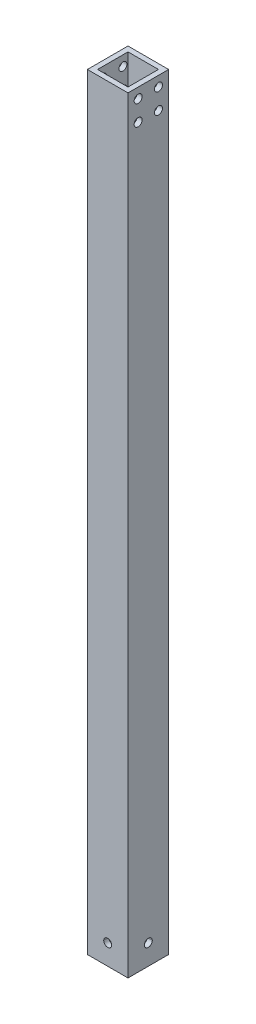
ISO-10303-21;
HEADER;
FILE_DESCRIPTION(('STEP AP214'),'2;1');
FILE_NAME('part.step','',(''),(''),'','','');
FILE_SCHEMA(('AUTOMOTIVE_DESIGN { 1 0 10303 214 1 1 1 1 }'));
ENDSEC;
DATA;
#1=APPLICATION_CONTEXT('core data for automotive mechanical design processes');
#2=APPLICATION_PROTOCOL_DEFINITION('international standard','automotive_design',2000,#1);
#3=PRODUCT_CONTEXT('',#1,'mechanical');
#4=PRODUCT('Part','Part','',(#3));
#5=PRODUCT_RELATED_PRODUCT_CATEGORY('part','',(#4));
#6=PRODUCT_DEFINITION_FORMATION('','',#4);
#7=PRODUCT_DEFINITION_CONTEXT('part definition',#1,'design');
#8=PRODUCT_DEFINITION('design','',#6,#7);
#9=PRODUCT_DEFINITION_SHAPE('','',#8);
#10=(LENGTH_UNIT() NAMED_UNIT(*) SI_UNIT(.MILLI.,.METRE.));
#11=(NAMED_UNIT(*) PLANE_ANGLE_UNIT() SI_UNIT($,.RADIAN.));
#12=(NAMED_UNIT(*) SI_UNIT($,.STERADIAN.) SOLID_ANGLE_UNIT());
#13=UNCERTAINTY_MEASURE_WITH_UNIT(LENGTH_MEASURE(1.E-05),#10,'distance_accuracy_value','');
#14=(GEOMETRIC_REPRESENTATION_CONTEXT(3) GLOBAL_UNCERTAINTY_ASSIGNED_CONTEXT((#13)) GLOBAL_UNIT_ASSIGNED_CONTEXT((#10,
#11,#12)) REPRESENTATION_CONTEXT('',''));
#15=CARTESIAN_POINT('',(0.,0.,0.));
#16=DIRECTION('',(0.,0.,1.));
#17=DIRECTION('',(1.,0.,0.));
#18=AXIS2_PLACEMENT_3D('',#15,#16,#17);
#19=CARTESIAN_POINT('',(-12.7,-227.0125,0.));
#20=DIRECTION('',(1.,0.,0.));
#21=DIRECTION('',(0.,0.,-1.));
#22=AXIS2_PLACEMENT_3D('',#19,#20,#21);
#23=CYLINDRICAL_SURFACE('',#22,2.4892);
#24=DIRECTION('',(1.,0.,0.));
#25=VECTOR('',#24,1.);
#26=CARTESIAN_POINT('',(-12.7,-227.0125,2.4892));
#27=LINE('',#26,#25);
#28=CARTESIAN_POINT('',(9.525,-227.0125,2.4892));
#29=VERTEX_POINT('',#28);
#30=CARTESIAN_POINT('',(12.7,-227.0125,2.4892));
#31=VERTEX_POINT('',#30);
#32=EDGE_CURVE('E214',#29,#31,#27,.T.);
#33=ORIENTED_EDGE('',*,*,#32,.F.);
#34=CARTESIAN_POINT('',(9.525,-227.0125,0.));
#35=DIRECTION('',(-1.,0.,0.));
#36=DIRECTION('',(0.,0.,1.));
#37=AXIS2_PLACEMENT_3D('',#34,#35,#36);
#38=CIRCLE('',#37,2.4892);
#39=CARTESIAN_POINT('',(9.525,-227.0125,-2.4892));
#40=VERTEX_POINT('',#39);
#41=EDGE_CURVE('E170',#29,#40,#38,.T.);
#42=ORIENTED_EDGE('',*,*,#41,.T.);
#43=DIRECTION('',(1.,0.,0.));
#44=VECTOR('',#43,1.);
#45=CARTESIAN_POINT('',(-12.7,-227.0125,-2.4892));
#46=LINE('',#45,#44);
#47=CARTESIAN_POINT('',(12.7,-227.0125,-2.4892));
#48=VERTEX_POINT('',#47);
#49=EDGE_CURVE('E226',#40,#48,#46,.T.);
#50=ORIENTED_EDGE('',*,*,#49,.T.);
#51=CARTESIAN_POINT('',(12.7,-227.0125,0.));
#52=DIRECTION('',(1.,0.,0.));
#53=DIRECTION('',(0.,0.,-1.));
#54=AXIS2_PLACEMENT_3D('',#51,#52,#53);
#55=CIRCLE('',#54,2.4892);
#56=EDGE_CURVE('E258',#48,#31,#55,.T.);
#57=ORIENTED_EDGE('',*,*,#56,.T.);
#58=EDGE_LOOP('',(#33,#42,#50,#57));
#59=FACE_BOUND('',#58,.T.);
#60=ADVANCED_FACE('F43',(#59),#23,.F.);
#61=CARTESIAN_POINT('',(-12.7,-227.0125,0.));
#62=DIRECTION('',(1.,0.,0.));
#63=DIRECTION('',(0.,0.,-1.));
#64=AXIS2_PLACEMENT_3D('',#61,#62,#63);
#65=CYLINDRICAL_SURFACE('',#64,2.4892);
#66=DIRECTION('',(1.,0.,0.));
#67=VECTOR('',#66,1.);
#68=CARTESIAN_POINT('',(-12.7,-227.0125,2.4892));
#69=LINE('',#68,#67);
#70=CARTESIAN_POINT('',(-12.7,-227.0125,2.4892));
#71=VERTEX_POINT('',#70);
#72=CARTESIAN_POINT('',(-9.525,-227.0125,2.4892));
#73=VERTEX_POINT('',#72);
#74=EDGE_CURVE('E225',#71,#73,#69,.T.);
#75=ORIENTED_EDGE('',*,*,#74,.F.);
#76=CARTESIAN_POINT('',(-12.7,-227.0125,0.));
#77=DIRECTION('',(1.,0.,0.));
#78=DIRECTION('',(0.,0.,-1.));
#79=AXIS2_PLACEMENT_3D('',#76,#77,#78);
#80=CIRCLE('',#79,2.4892);
#81=CARTESIAN_POINT('',(-12.7,-227.0125,-2.4892));
#82=VERTEX_POINT('',#81);
#83=EDGE_CURVE('E287',#82,#71,#80,.T.);
#84=ORIENTED_EDGE('',*,*,#83,.F.);
#85=DIRECTION('',(1.,0.,0.));
#86=VECTOR('',#85,1.);
#87=CARTESIAN_POINT('',(-12.7,-227.0125,-2.4892));
#88=LINE('',#87,#86);
#89=CARTESIAN_POINT('',(-9.525,-227.0125,-2.4892));
#90=VERTEX_POINT('',#89);
#91=EDGE_CURVE('E216',#82,#90,#88,.T.);
#92=ORIENTED_EDGE('',*,*,#91,.T.);
#93=CARTESIAN_POINT('',(-9.525,-227.0125,0.));
#94=DIRECTION('',(1.,0.,0.));
#95=DIRECTION('',(0.,0.,-1.));
#96=AXIS2_PLACEMENT_3D('',#93,#94,#95);
#97=CIRCLE('',#96,2.4892);
#98=EDGE_CURVE('E54',#90,#73,#97,.T.);
#99=ORIENTED_EDGE('',*,*,#98,.T.);
#100=EDGE_LOOP('',(#75,#84,#92,#99));
#101=FACE_BOUND('',#100,.T.);
#102=ADVANCED_FACE('F498',(#101),#65,.F.);
#103=CARTESIAN_POINT('',(0.,-227.0125,-12.7));
#104=DIRECTION('',(0.,0.,1.));
#105=DIRECTION('',(1.,0.,0.));
#106=AXIS2_PLACEMENT_3D('',#103,#104,#105);
#107=CYLINDRICAL_SURFACE('',#106,2.4892);
#108=DIRECTION('',(0.,0.,1.));
#109=VECTOR('',#108,1.);
#110=CARTESIAN_POINT('',(-2.4892,-227.0125,-12.7));
#111=LINE('',#110,#109);
#112=CARTESIAN_POINT('',(-2.4892,-227.0125,-12.7));
#113=VERTEX_POINT('',#112);
#114=CARTESIAN_POINT('',(-2.4892,-227.0125,-9.525));
#115=VERTEX_POINT('',#114);
#116=EDGE_CURVE('E253',#113,#115,#111,.T.);
#117=ORIENTED_EDGE('',*,*,#116,.F.);
#118=CARTESIAN_POINT('',(0.,-227.0125,-12.7));
#119=DIRECTION('',(0.,0.,1.));
#120=DIRECTION('',(1.,0.,0.));
#121=AXIS2_PLACEMENT_3D('',#118,#119,#120);
#122=CIRCLE('',#121,2.4892);
#123=CARTESIAN_POINT('',(2.4892,-227.0125,-12.7));
#124=VERTEX_POINT('',#123);
#125=EDGE_CURVE('E272',#124,#113,#122,.T.);
#126=ORIENTED_EDGE('',*,*,#125,.F.);
#127=DIRECTION('',(0.,0.,1.));
#128=VECTOR('',#127,1.);
#129=CARTESIAN_POINT('',(2.4892,-227.0125,-12.7));
#130=LINE('',#129,#128);
#131=CARTESIAN_POINT('',(2.4892,-227.0125,-9.525));
#132=VERTEX_POINT('',#131);
#133=EDGE_CURVE('E231',#124,#132,#130,.T.);
#134=ORIENTED_EDGE('',*,*,#133,.T.);
#135=CARTESIAN_POINT('',(0.,-227.0125,-9.525));
#136=DIRECTION('',(0.,0.,1.));
#137=DIRECTION('',(1.,0.,0.));
#138=AXIS2_PLACEMENT_3D('',#135,#136,#137);
#139=CIRCLE('',#138,2.4892);
#140=EDGE_CURVE('E247',#132,#115,#139,.T.);
#141=ORIENTED_EDGE('',*,*,#140,.T.);
#142=EDGE_LOOP('',(#117,#126,#134,#141));
#143=FACE_BOUND('',#142,.T.);
#144=ADVANCED_FACE('F434',(#143),#107,.F.);
#145=CARTESIAN_POINT('',(0.,-227.0125,-12.7));
#146=DIRECTION('',(0.,0.,1.));
#147=DIRECTION('',(1.,0.,0.));
#148=AXIS2_PLACEMENT_3D('',#145,#146,#147);
#149=CYLINDRICAL_SURFACE('',#148,2.4892);
#150=DIRECTION('',(0.,0.,1.));
#151=VECTOR('',#150,1.);
#152=CARTESIAN_POINT('',(-2.4892,-227.0125,-12.7));
#153=LINE('',#152,#151);
#154=CARTESIAN_POINT('',(-2.4892,-227.0125,9.525));
#155=VERTEX_POINT('',#154);
#156=CARTESIAN_POINT('',(-2.4892,-227.0125,12.7));
#157=VERTEX_POINT('',#156);
#158=EDGE_CURVE('E316',#155,#157,#153,.T.);
#159=ORIENTED_EDGE('',*,*,#158,.F.);
#160=CARTESIAN_POINT('',(0.,-227.0125,9.525));
#161=DIRECTION('',(0.,0.,-1.));
#162=DIRECTION('',(-1.,0.,0.));
#163=AXIS2_PLACEMENT_3D('',#160,#161,#162);
#164=CIRCLE('',#163,2.4892);
#165=CARTESIAN_POINT('',(2.4892,-227.0125,9.525));
#166=VERTEX_POINT('',#165);
#167=EDGE_CURVE('E11',#155,#166,#164,.T.);
#168=ORIENTED_EDGE('',*,*,#167,.T.);
#169=DIRECTION('',(0.,0.,1.));
#170=VECTOR('',#169,1.);
#171=CARTESIAN_POINT('',(2.4892,-227.0125,-12.7));
#172=LINE('',#171,#170);
#173=CARTESIAN_POINT('',(2.4892,-227.0125,12.7));
#174=VERTEX_POINT('',#173);
#175=EDGE_CURVE('E246',#166,#174,#172,.T.);
#176=ORIENTED_EDGE('',*,*,#175,.T.);
#177=CARTESIAN_POINT('',(0.,-227.0125,12.7));
#178=DIRECTION('',(0.,0.,1.));
#179=DIRECTION('',(1.,0.,0.));
#180=AXIS2_PLACEMENT_3D('',#177,#178,#179);
#181=CIRCLE('',#180,2.4892);
#182=EDGE_CURVE('E278',#174,#157,#181,.T.);
#183=ORIENTED_EDGE('',*,*,#182,.T.);
#184=EDGE_LOOP('',(#159,#168,#176,#183));
#185=FACE_BOUND('',#184,.T.);
#186=ADVANCED_FACE('F407',(#185),#149,.F.);
#187=CARTESIAN_POINT('',(0.,239.7125,9.525));
#188=DIRECTION('',(0.,0.,-1.));
#189=DIRECTION('',(0.,-1.,0.));
#190=AXIS2_PLACEMENT_3D('',#187,#188,#189);
#191=PLANE('',#190);
#192=CARTESIAN_POINT('',(0.,-227.0125,9.525));
#193=DIRECTION('',(0.,0.,-1.));
#194=DIRECTION('',(-1.,0.,0.));
#195=AXIS2_PLACEMENT_3D('',#192,#193,#194);
#196=CIRCLE('',#195,2.4892);
#197=EDGE_CURVE('E234',#166,#155,#196,.T.);
#198=ORIENTED_EDGE('',*,*,#197,.F.);
#199=ORIENTED_EDGE('',*,*,#167,.F.);
#200=EDGE_LOOP('',(#198,#199));
#201=FACE_BOUND('',#200,.T.);
#202=DIRECTION('',(1.,0.,0.));
#203=VECTOR('',#202,1.);
#204=CARTESIAN_POINT('',(0.,-239.7125,9.525));
#205=LINE('',#204,#203);
#206=CARTESIAN_POINT('',(-9.525,-239.7125,9.525));
#207=VERTEX_POINT('',#206);
#208=CARTESIAN_POINT('',(9.525,-239.7125,9.525));
#209=VERTEX_POINT('',#208);
#210=EDGE_CURVE('E186',#207,#209,#205,.T.);
#211=ORIENTED_EDGE('',*,*,#210,.F.);
#212=DIRECTION('',(0.,-1.,0.));
#213=VECTOR('',#212,1.);
#214=CARTESIAN_POINT('',(-9.525,239.7125,9.525));
#215=LINE('',#214,#213);
#216=CARTESIAN_POINT('',(-9.525,239.7125,9.525));
#217=VERTEX_POINT('',#216);
#218=EDGE_CURVE('E68',#217,#207,#215,.T.);
#219=ORIENTED_EDGE('',*,*,#218,.F.);
#220=DIRECTION('',(1.,0.,0.));
#221=VECTOR('',#220,1.);
#222=CARTESIAN_POINT('',(0.,239.7125,9.525));
#223=LINE('',#222,#221);
#224=CARTESIAN_POINT('',(9.525,239.7125,9.525));
#225=VERTEX_POINT('',#224);
#226=EDGE_CURVE('E202',#217,#225,#223,.T.);
#227=ORIENTED_EDGE('',*,*,#226,.T.);
#228=DIRECTION('',(0.,-1.,0.));
#229=VECTOR('',#228,1.);
#230=CARTESIAN_POINT('',(9.525,239.7125,9.525));
#231=LINE('',#230,#229);
#232=EDGE_CURVE('E171',#225,#209,#231,.T.);
#233=ORIENTED_EDGE('',*,*,#232,.T.);
#234=EDGE_LOOP('',(#211,#219,#227,#233));
#235=FACE_BOUND('',#234,.T.);
#236=ADVANCED_FACE('F404',(#201,#235),#191,.T.);
#237=CARTESIAN_POINT('',(-9.525,239.7125,0.));
#238=DIRECTION('',(1.,0.,0.));
#239=DIRECTION('',(0.,1.,0.));
#240=AXIS2_PLACEMENT_3D('',#237,#238,#239);
#241=PLANE('',#240);
#242=CARTESIAN_POINT('',(-9.525,233.3625,6.35));
#243=DIRECTION('',(1.,0.,0.));
#244=DIRECTION('',(0.,0.,-1.));
#245=AXIS2_PLACEMENT_3D('',#242,#243,#244);
#246=CIRCLE('',#245,2.51460000000001);
#247=CARTESIAN_POINT('',(-9.525,233.3625,3.83539999999998));
#248=VERTEX_POINT('',#247);
#249=EDGE_CURVE('E215',#248,#248,#246,.T.);
#250=ORIENTED_EDGE('',*,*,#249,.F.);
#251=EDGE_LOOP('',(#250));
#252=FACE_BOUND('',#251,.T.);
#253=CARTESIAN_POINT('',(-9.525,220.6625,-6.35));
#254=DIRECTION('',(1.,0.,0.));
#255=DIRECTION('',(0.,0.,-1.));
#256=AXIS2_PLACEMENT_3D('',#253,#254,#255);
#257=CIRCLE('',#256,2.51460000000001);
#258=CARTESIAN_POINT('',(-9.525,220.6625,-8.86460000000001));
#259=VERTEX_POINT('',#258);
#260=EDGE_CURVE('E905',#259,#259,#257,.T.);
#261=ORIENTED_EDGE('',*,*,#260,.F.);
#262=EDGE_LOOP('',(#261));
#263=FACE_BOUND('',#262,.T.);
#264=CARTESIAN_POINT('',(-9.525,220.6625,6.35));
#265=DIRECTION('',(1.,0.,0.));
#266=DIRECTION('',(0.,0.,-1.));
#267=AXIS2_PLACEMENT_3D('',#264,#265,#266);
#268=CIRCLE('',#267,2.51460000000001);
#269=CARTESIAN_POINT('',(-9.525,220.6625,3.83539999999998));
#270=VERTEX_POINT('',#269);
#271=EDGE_CURVE('E899',#270,#270,#268,.T.);
#272=ORIENTED_EDGE('',*,*,#271,.F.);
#273=EDGE_LOOP('',(#272));
#274=FACE_BOUND('',#273,.T.);
#275=CARTESIAN_POINT('',(-9.525,233.3625,-6.35));
#276=DIRECTION('',(1.,0.,0.));
#277=DIRECTION('',(0.,0.,-1.));
#278=AXIS2_PLACEMENT_3D('',#275,#276,#277);
#279=CIRCLE('',#278,2.51460000000001);
#280=CARTESIAN_POINT('',(-9.525,233.3625,-8.86460000000001));
#281=VERTEX_POINT('',#280);
#282=EDGE_CURVE('E893',#281,#281,#279,.T.);
#283=ORIENTED_EDGE('',*,*,#282,.F.);
#284=EDGE_LOOP('',(#283));
#285=FACE_BOUND('',#284,.T.);
#286=ORIENTED_EDGE('',*,*,#98,.F.);
#287=CARTESIAN_POINT('',(-9.525,-227.0125,0.));
#288=DIRECTION('',(1.,0.,0.));
#289=DIRECTION('',(0.,0.,-1.));
#290=AXIS2_PLACEMENT_3D('',#287,#288,#289);
#291=CIRCLE('',#290,2.4892);
#292=EDGE_CURVE('E220',#73,#90,#291,.T.);
#293=ORIENTED_EDGE('',*,*,#292,.F.);
#294=EDGE_LOOP('',(#286,#293));
#295=FACE_BOUND('',#294,.T.);
#296=DIRECTION('',(0.,0.,1.));
#297=VECTOR('',#296,1.);
#298=CARTESIAN_POINT('',(-9.525,-239.7125,0.));
#299=LINE('',#298,#297);
#300=CARTESIAN_POINT('',(-9.525,-239.7125,-9.525));
#301=VERTEX_POINT('',#300);
#302=EDGE_CURVE('E181',#301,#207,#299,.T.);
#303=ORIENTED_EDGE('',*,*,#302,.F.);
#304=DIRECTION('',(0.,-1.,0.));
#305=VECTOR('',#304,1.);
#306=CARTESIAN_POINT('',(-9.525,239.7125,-9.525));
#307=LINE('',#306,#305);
#308=CARTESIAN_POINT('',(-9.525,239.7125,-9.525));
#309=VERTEX_POINT('',#308);
#310=EDGE_CURVE('E177',#309,#301,#307,.T.);
#311=ORIENTED_EDGE('',*,*,#310,.F.);
#312=DIRECTION('',(0.,0.,1.));
#313=VECTOR('',#312,1.);
#314=CARTESIAN_POINT('',(-9.525,239.7125,0.));
#315=LINE('',#314,#313);
#316=EDGE_CURVE('E240',#309,#217,#315,.T.);
#317=ORIENTED_EDGE('',*,*,#316,.T.);
#318=ORIENTED_EDGE('',*,*,#218,.T.);
#319=EDGE_LOOP('',(#303,#311,#317,#318));
#320=FACE_BOUND('',#319,.T.);
#321=ADVANCED_FACE('F479',(#252,#263,#274,#285,#295,#320),#241,.T.);
#322=CARTESIAN_POINT('',(0.,239.7125,-9.525));
#323=DIRECTION('',(0.,0.,1.));
#324=DIRECTION('',(1.,0.,0.));
#325=AXIS2_PLACEMENT_3D('',#322,#323,#324);
#326=PLANE('',#325);
#327=ORIENTED_EDGE('',*,*,#140,.F.);
#328=CARTESIAN_POINT('',(0.,-227.0125,-9.525));
#329=DIRECTION('',(0.,0.,1.));
#330=DIRECTION('',(1.,0.,0.));
#331=AXIS2_PLACEMENT_3D('',#328,#329,#330);
#332=CIRCLE('',#331,2.4892);
#333=EDGE_CURVE('E235',#115,#132,#332,.T.);
#334=ORIENTED_EDGE('',*,*,#333,.F.);
#335=EDGE_LOOP('',(#327,#334));
#336=FACE_BOUND('',#335,.T.);
#337=DIRECTION('',(-1.,0.,0.));
#338=VECTOR('',#337,1.);
#339=CARTESIAN_POINT('',(0.,-239.7125,-9.525));
#340=LINE('',#339,#338);
#341=CARTESIAN_POINT('',(9.525,-239.7125,-9.525));
#342=VERTEX_POINT('',#341);
#343=EDGE_CURVE('E174',#342,#301,#340,.T.);
#344=ORIENTED_EDGE('',*,*,#343,.F.);
#345=DIRECTION('',(0.,-1.,0.));
#346=VECTOR('',#345,1.);
#347=CARTESIAN_POINT('',(9.525,239.7125,-9.525));
#348=LINE('',#347,#346);
#349=CARTESIAN_POINT('',(9.525,239.7125,-9.525));
#350=VERTEX_POINT('',#349);
#351=EDGE_CURVE('E158',#350,#342,#348,.T.);
#352=ORIENTED_EDGE('',*,*,#351,.F.);
#353=DIRECTION('',(-1.,0.,0.));
#354=VECTOR('',#353,1.);
#355=CARTESIAN_POINT('',(0.,239.7125,-9.525));
#356=LINE('',#355,#354);
#357=EDGE_CURVE('E203',#350,#309,#356,.T.);
#358=ORIENTED_EDGE('',*,*,#357,.T.);
#359=ORIENTED_EDGE('',*,*,#310,.T.);
#360=EDGE_LOOP('',(#344,#352,#358,#359));
#361=FACE_BOUND('',#360,.T.);
#362=ADVANCED_FACE('F175',(#336,#361),#326,.T.);
#363=CARTESIAN_POINT('',(9.525,239.7125,0.));
#364=DIRECTION('',(-1.,0.,0.));
#365=DIRECTION('',(0.,0.,1.));
#366=AXIS2_PLACEMENT_3D('',#363,#364,#365);
#367=PLANE('',#366);
#368=CARTESIAN_POINT('',(9.525,233.3625,6.35));
#369=DIRECTION('',(-1.,0.,0.));
#370=DIRECTION('',(0.,0.,1.));
#371=AXIS2_PLACEMENT_3D('',#368,#369,#370);
#372=CIRCLE('',#371,2.51460000000001);
#373=CARTESIAN_POINT('',(9.525,233.3625,8.86460000000001));
#374=VERTEX_POINT('',#373);
#375=EDGE_CURVE('E907',#374,#374,#372,.T.);
#376=ORIENTED_EDGE('',*,*,#375,.F.);
#377=EDGE_LOOP('',(#376));
#378=FACE_BOUND('',#377,.T.);
#379=CARTESIAN_POINT('',(9.525,220.6625,-6.35));
#380=DIRECTION('',(-1.,0.,0.));
#381=DIRECTION('',(0.,0.,1.));
#382=AXIS2_PLACEMENT_3D('',#379,#380,#381);
#383=CIRCLE('',#382,2.51460000000001);
#384=CARTESIAN_POINT('',(9.525,220.6625,-3.83539999999999));
#385=VERTEX_POINT('',#384);
#386=EDGE_CURVE('E902',#385,#385,#383,.T.);
#387=ORIENTED_EDGE('',*,*,#386,.F.);
#388=EDGE_LOOP('',(#387));
#389=FACE_BOUND('',#388,.T.);
#390=CARTESIAN_POINT('',(9.525,220.6625,6.35));
#391=DIRECTION('',(-1.,0.,0.));
#392=DIRECTION('',(0.,0.,1.));
#393=AXIS2_PLACEMENT_3D('',#390,#391,#392);
#394=CIRCLE('',#393,2.51460000000001);
#395=CARTESIAN_POINT('',(9.525,220.6625,8.86460000000001));
#396=VERTEX_POINT('',#395);
#397=EDGE_CURVE('E896',#396,#396,#394,.T.);
#398=ORIENTED_EDGE('',*,*,#397,.F.);
#399=EDGE_LOOP('',(#398));
#400=FACE_BOUND('',#399,.T.);
#401=CARTESIAN_POINT('',(9.525,233.3625,-6.35));
#402=DIRECTION('',(-1.,0.,0.));
#403=DIRECTION('',(0.,0.,1.));
#404=AXIS2_PLACEMENT_3D('',#401,#402,#403);
#405=CIRCLE('',#404,2.51460000000001);
#406=CARTESIAN_POINT('',(9.525,233.3625,-3.83539999999999));
#407=VERTEX_POINT('',#406);
#408=EDGE_CURVE('E889',#407,#407,#405,.T.);
#409=ORIENTED_EDGE('',*,*,#408,.F.);
#410=EDGE_LOOP('',(#409));
#411=FACE_BOUND('',#410,.T.);
#412=CARTESIAN_POINT('',(9.525,-227.0125,0.));
#413=DIRECTION('',(-1.,0.,0.));
#414=DIRECTION('',(0.,0.,1.));
#415=AXIS2_PLACEMENT_3D('',#412,#413,#414);
#416=CIRCLE('',#415,2.4892);
#417=EDGE_CURVE('E210',#40,#29,#416,.T.);
#418=ORIENTED_EDGE('',*,*,#417,.F.);
#419=ORIENTED_EDGE('',*,*,#41,.F.);
#420=EDGE_LOOP('',(#418,#419));
#421=FACE_BOUND('',#420,.T.);
#422=DIRECTION('',(0.,0.,-1.));
#423=VECTOR('',#422,1.);
#424=CARTESIAN_POINT('',(9.525,-239.7125,0.));
#425=LINE('',#424,#423);
#426=EDGE_CURVE('E163',#209,#342,#425,.T.);
#427=ORIENTED_EDGE('',*,*,#426,.F.);
#428=ORIENTED_EDGE('',*,*,#232,.F.);
#429=DIRECTION('',(0.,0.,-1.));
#430=VECTOR('',#429,1.);
#431=CARTESIAN_POINT('',(9.525,239.7125,0.));
#432=LINE('',#431,#430);
#433=EDGE_CURVE('E165',#225,#350,#432,.T.);
#434=ORIENTED_EDGE('',*,*,#433,.T.);
#435=ORIENTED_EDGE('',*,*,#351,.T.);
#436=EDGE_LOOP('',(#427,#428,#434,#435));
#437=FACE_BOUND('',#436,.T.);
#438=ADVANCED_FACE('F160',(#378,#389,#400,#411,#421,#437),#367,.T.);
#439=CARTESIAN_POINT('',(-12.7,239.7125,12.7));
#440=DIRECTION('',(0.,0.,-1.));
#441=DIRECTION('',(0.,-1.,0.));
#442=AXIS2_PLACEMENT_3D('',#439,#440,#441);
#443=PLANE('',#442);
#444=ORIENTED_EDGE('',*,*,#182,.F.);
#445=CARTESIAN_POINT('',(0.,-227.0125,12.7));
#446=DIRECTION('',(0.,0.,1.));
#447=DIRECTION('',(1.,0.,0.));
#448=AXIS2_PLACEMENT_3D('',#445,#446,#447);
#449=CIRCLE('',#448,2.4892);
#450=EDGE_CURVE('E47',#157,#174,#449,.T.);
#451=ORIENTED_EDGE('',*,*,#450,.F.);
#452=EDGE_LOOP('',(#444,#451));
#453=FACE_BOUND('',#452,.T.);
#454=DIRECTION('',(1.,0.,0.));
#455=VECTOR('',#454,1.);
#456=CARTESIAN_POINT('',(-12.7,-239.7125,12.7));
#457=LINE('',#456,#455);
#458=CARTESIAN_POINT('',(-12.7,-239.7125,12.7));
#459=VERTEX_POINT('',#458);
#460=CARTESIAN_POINT('',(12.7,-239.7125,12.7));
#461=VERTEX_POINT('',#460);
#462=EDGE_CURVE('E205',#459,#461,#457,.T.);
#463=ORIENTED_EDGE('',*,*,#462,.T.);
#464=DIRECTION('',(0.,-1.,0.));
#465=VECTOR('',#464,1.);
#466=CARTESIAN_POINT('',(12.7,239.7125,12.7));
#467=LINE('',#466,#465);
#468=CARTESIAN_POINT('',(12.7,239.7125,12.7));
#469=VERTEX_POINT('',#468);
#470=EDGE_CURVE('E254',#469,#461,#467,.T.);
#471=ORIENTED_EDGE('',*,*,#470,.F.);
#472=DIRECTION('',(1.,0.,0.));
#473=VECTOR('',#472,1.);
#474=CARTESIAN_POINT('',(-12.7,239.7125,12.7));
#475=LINE('',#474,#473);
#476=CARTESIAN_POINT('',(-12.7,239.7125,12.7));
#477=VERTEX_POINT('',#476);
#478=EDGE_CURVE('E268',#477,#469,#475,.T.);
#479=ORIENTED_EDGE('',*,*,#478,.F.);
#480=DIRECTION('',(0.,-1.,0.));
#481=VECTOR('',#480,1.);
#482=CARTESIAN_POINT('',(-12.7,239.7125,12.7));
#483=LINE('',#482,#481);
#484=EDGE_CURVE('E298',#477,#459,#483,.T.);
#485=ORIENTED_EDGE('',*,*,#484,.T.);
#486=EDGE_LOOP('',(#463,#471,#479,#485));
#487=FACE_BOUND('',#486,.T.);
#488=ADVANCED_FACE('F410',(#453,#487),#443,.F.);
#489=CARTESIAN_POINT('',(-12.7,239.7125,12.7));
#490=DIRECTION('',(1.,0.,0.));
#491=DIRECTION('',(0.,1.,0.));
#492=AXIS2_PLACEMENT_3D('',#489,#490,#491);
#493=PLANE('',#492);
#494=CARTESIAN_POINT('',(-12.7,233.3625,6.35));
#495=DIRECTION('',(-1.,0.,0.));
#496=DIRECTION('',(0.,0.,1.));
#497=AXIS2_PLACEMENT_3D('',#494,#495,#496);
#498=CIRCLE('',#497,2.51460000000001);
#499=CARTESIAN_POINT('',(-12.7,233.3625,8.86460000000001));
#500=VERTEX_POINT('',#499);
#501=EDGE_CURVE('E868',#500,#500,#498,.T.);
#502=ORIENTED_EDGE('',*,*,#501,.F.);
#503=EDGE_LOOP('',(#502));
#504=FACE_BOUND('',#503,.T.);
#505=CARTESIAN_POINT('',(-12.7,220.6625,-6.35));
#506=DIRECTION('',(-1.,0.,0.));
#507=DIRECTION('',(0.,0.,1.));
#508=AXIS2_PLACEMENT_3D('',#505,#506,#507);
#509=CIRCLE('',#508,2.51460000000001);
#510=CARTESIAN_POINT('',(-12.7,220.6625,-3.83539999999999));
#511=VERTEX_POINT('',#510);
#512=EDGE_CURVE('E876',#511,#511,#509,.T.);
#513=ORIENTED_EDGE('',*,*,#512,.F.);
#514=EDGE_LOOP('',(#513));
#515=FACE_BOUND('',#514,.T.);
#516=CARTESIAN_POINT('',(-12.7,220.6625,6.35));
#517=DIRECTION('',(-1.,0.,0.));
#518=DIRECTION('',(0.,0.,1.));
#519=AXIS2_PLACEMENT_3D('',#516,#517,#518);
#520=CIRCLE('',#519,2.51460000000001);
#521=CARTESIAN_POINT('',(-12.7,220.6625,8.86460000000001));
#522=VERTEX_POINT('',#521);
#523=EDGE_CURVE('E887',#522,#522,#520,.T.);
#524=ORIENTED_EDGE('',*,*,#523,.F.);
#525=EDGE_LOOP('',(#524));
#526=FACE_BOUND('',#525,.T.);
#527=CARTESIAN_POINT('',(-12.7,233.3625,-6.35));
#528=DIRECTION('',(-1.,0.,0.));
#529=DIRECTION('',(0.,0.,1.));
#530=AXIS2_PLACEMENT_3D('',#527,#528,#529);
#531=CIRCLE('',#530,2.51460000000001);
#532=CARTESIAN_POINT('',(-12.7,233.3625,-3.83539999999999));
#533=VERTEX_POINT('',#532);
#534=EDGE_CURVE('E869',#533,#533,#531,.T.);
#535=ORIENTED_EDGE('',*,*,#534,.F.);
#536=EDGE_LOOP('',(#535));
#537=FACE_BOUND('',#536,.T.);
#538=ORIENTED_EDGE('',*,*,#83,.T.);
#539=CARTESIAN_POINT('',(-12.7,-227.0125,0.));
#540=DIRECTION('',(1.,0.,0.));
#541=DIRECTION('',(0.,0.,-1.));
#542=AXIS2_PLACEMENT_3D('',#539,#540,#541);
#543=CIRCLE('',#542,2.4892);
#544=EDGE_CURVE('E221',#71,#82,#543,.T.);
#545=ORIENTED_EDGE('',*,*,#544,.T.);
#546=EDGE_LOOP('',(#538,#545));
#547=FACE_BOUND('',#546,.T.);
#548=DIRECTION('',(0.,0.,1.));
#549=VECTOR('',#548,1.);
#550=CARTESIAN_POINT('',(-12.7,-239.7125,12.7));
#551=LINE('',#550,#549);
#552=CARTESIAN_POINT('',(-12.7,-239.7125,-12.7));
#553=VERTEX_POINT('',#552);
#554=EDGE_CURVE('E196',#553,#459,#551,.T.);
#555=ORIENTED_EDGE('',*,*,#554,.T.);
#556=ORIENTED_EDGE('',*,*,#484,.F.);
#557=DIRECTION('',(0.,0.,1.));
#558=VECTOR('',#557,1.);
#559=CARTESIAN_POINT('',(-12.7,239.7125,12.7));
#560=LINE('',#559,#558);
#561=CARTESIAN_POINT('',(-12.7,239.7125,-12.7));
#562=VERTEX_POINT('',#561);
#563=EDGE_CURVE('E264',#562,#477,#560,.T.);
#564=ORIENTED_EDGE('',*,*,#563,.F.);
#565=DIRECTION('',(0.,-1.,0.));
#566=VECTOR('',#565,1.);
#567=CARTESIAN_POINT('',(-12.7,239.7125,-12.7));
#568=LINE('',#567,#566);
#569=EDGE_CURVE('E269',#562,#553,#568,.T.);
#570=ORIENTED_EDGE('',*,*,#569,.T.);
#571=EDGE_LOOP('',(#555,#556,#564,#570));
#572=FACE_BOUND('',#571,.T.);
#573=ADVANCED_FACE('F446',(#504,#515,#526,#537,#547,#572),#493,.F.);
#574=CARTESIAN_POINT('',(-12.7,239.7125,-12.7));
#575=DIRECTION('',(0.,0.,1.));
#576=DIRECTION('',(1.,0.,0.));
#577=AXIS2_PLACEMENT_3D('',#574,#575,#576);
#578=PLANE('',#577);
#579=ORIENTED_EDGE('',*,*,#125,.T.);
#580=CARTESIAN_POINT('',(0.,-227.0125,-12.7));
#581=DIRECTION('',(0.,0.,1.));
#582=DIRECTION('',(1.,0.,0.));
#583=AXIS2_PLACEMENT_3D('',#580,#581,#582);
#584=CIRCLE('',#583,2.4892);
#585=EDGE_CURVE('E200',#113,#124,#584,.T.);
#586=ORIENTED_EDGE('',*,*,#585,.T.);
#587=EDGE_LOOP('',(#579,#586));
#588=FACE_BOUND('',#587,.T.);
#589=DIRECTION('',(-1.,0.,0.));
#590=VECTOR('',#589,1.);
#591=CARTESIAN_POINT('',(-12.7,-239.7125,-12.7));
#592=LINE('',#591,#590);
#593=CARTESIAN_POINT('',(12.7,-239.7125,-12.7));
#594=VERTEX_POINT('',#593);
#595=EDGE_CURVE('E188',#594,#553,#592,.T.);
#596=ORIENTED_EDGE('',*,*,#595,.T.);
#597=ORIENTED_EDGE('',*,*,#569,.F.);
#598=DIRECTION('',(-1.,0.,0.));
#599=VECTOR('',#598,1.);
#600=CARTESIAN_POINT('',(-12.7,239.7125,-12.7));
#601=LINE('',#600,#599);
#602=CARTESIAN_POINT('',(12.7,239.7125,-12.7));
#603=VERTEX_POINT('',#602);
#604=EDGE_CURVE('E245',#603,#562,#601,.T.);
#605=ORIENTED_EDGE('',*,*,#604,.F.);
#606=DIRECTION('',(0.,-1.,0.));
#607=VECTOR('',#606,1.);
#608=CARTESIAN_POINT('',(12.7,239.7125,-12.7));
#609=LINE('',#608,#607);
#610=EDGE_CURVE('E259',#603,#594,#609,.T.);
#611=ORIENTED_EDGE('',*,*,#610,.T.);
#612=EDGE_LOOP('',(#596,#597,#605,#611));
#613=FACE_BOUND('',#612,.T.);
#614=ADVANCED_FACE('F336',(#588,#613),#578,.F.);
#615=CARTESIAN_POINT('',(12.7,239.7125,12.7));
#616=DIRECTION('',(-1.,0.,0.));
#617=DIRECTION('',(0.,0.,1.));
#618=AXIS2_PLACEMENT_3D('',#615,#616,#617);
#619=PLANE('',#618);
#620=CARTESIAN_POINT('',(12.7,233.3625,6.35));
#621=DIRECTION('',(-1.,0.,0.));
#622=DIRECTION('',(0.,0.,1.));
#623=AXIS2_PLACEMENT_3D('',#620,#621,#622);
#624=CIRCLE('',#623,2.51460000000001);
#625=CARTESIAN_POINT('',(12.7,233.3625,8.86460000000001));
#626=VERTEX_POINT('',#625);
#627=EDGE_CURVE('E870',#626,#626,#624,.T.);
#628=ORIENTED_EDGE('',*,*,#627,.T.);
#629=EDGE_LOOP('',(#628));
#630=FACE_BOUND('',#629,.T.);
#631=CARTESIAN_POINT('',(12.7,220.6625,-6.35));
#632=DIRECTION('',(-1.,0.,0.));
#633=DIRECTION('',(0.,0.,1.));
#634=AXIS2_PLACEMENT_3D('',#631,#632,#633);
#635=CIRCLE('',#634,2.51460000000001);
#636=CARTESIAN_POINT('',(12.7,220.6625,-3.83539999999999));
#637=VERTEX_POINT('',#636);
#638=EDGE_CURVE('E884',#637,#637,#635,.T.);
#639=ORIENTED_EDGE('',*,*,#638,.T.);
#640=EDGE_LOOP('',(#639));
#641=FACE_BOUND('',#640,.T.);
#642=CARTESIAN_POINT('',(12.7,220.6625,6.35));
#643=DIRECTION('',(-1.,0.,0.));
#644=DIRECTION('',(0.,0.,1.));
#645=AXIS2_PLACEMENT_3D('',#642,#643,#644);
#646=CIRCLE('',#645,2.51460000000001);
#647=CARTESIAN_POINT('',(12.7,220.6625,8.86460000000001));
#648=VERTEX_POINT('',#647);
#649=EDGE_CURVE('E879',#648,#648,#646,.T.);
#650=ORIENTED_EDGE('',*,*,#649,.T.);
#651=EDGE_LOOP('',(#650));
#652=FACE_BOUND('',#651,.T.);
#653=CARTESIAN_POINT('',(12.7,233.3625,-6.35));
#654=DIRECTION('',(-1.,0.,0.));
#655=DIRECTION('',(0.,0.,1.));
#656=AXIS2_PLACEMENT_3D('',#653,#654,#655);
#657=CIRCLE('',#656,2.51460000000001);
#658=CARTESIAN_POINT('',(12.7,233.3625,-3.83539999999999));
#659=VERTEX_POINT('',#658);
#660=EDGE_CURVE('E873',#659,#659,#657,.T.);
#661=ORIENTED_EDGE('',*,*,#660,.T.);
#662=EDGE_LOOP('',(#661));
#663=FACE_BOUND('',#662,.T.);
#664=ORIENTED_EDGE('',*,*,#56,.F.);
#665=CARTESIAN_POINT('',(12.7,-227.0125,0.));
#666=DIRECTION('',(1.,0.,0.));
#667=DIRECTION('',(0.,0.,-1.));
#668=AXIS2_PLACEMENT_3D('',#665,#666,#667);
#669=CIRCLE('',#668,2.4892);
#670=EDGE_CURVE('E230',#31,#48,#669,.T.);
#671=ORIENTED_EDGE('',*,*,#670,.F.);
#672=EDGE_LOOP('',(#664,#671));
#673=FACE_BOUND('',#672,.T.);
#674=DIRECTION('',(0.,0.,-1.));
#675=VECTOR('',#674,1.);
#676=CARTESIAN_POINT('',(12.7,-239.7125,12.7));
#677=LINE('',#676,#675);
#678=EDGE_CURVE('E209',#461,#594,#677,.T.);
#679=ORIENTED_EDGE('',*,*,#678,.T.);
#680=ORIENTED_EDGE('',*,*,#610,.F.);
#681=DIRECTION('',(0.,0.,-1.));
#682=VECTOR('',#681,1.);
#683=CARTESIAN_POINT('',(12.7,239.7125,12.7));
#684=LINE('',#683,#682);
#685=EDGE_CURVE('E241',#469,#603,#684,.T.);
#686=ORIENTED_EDGE('',*,*,#685,.F.);
#687=ORIENTED_EDGE('',*,*,#470,.T.);
#688=EDGE_LOOP('',(#679,#680,#686,#687));
#689=FACE_BOUND('',#688,.T.);
#690=ADVANCED_FACE('F368',(#630,#641,#652,#663,#673,#689),#619,.F.);
#691=CARTESIAN_POINT('',(0.,-239.7125,0.));
#692=DIRECTION('',(0.,1.,0.));
#693=DIRECTION('',(1.,0.,0.));
#694=AXIS2_PLACEMENT_3D('',#691,#692,#693);
#695=PLANE('',#694);
#696=ORIENTED_EDGE('',*,*,#426,.T.);
#697=ORIENTED_EDGE('',*,*,#343,.T.);
#698=ORIENTED_EDGE('',*,*,#302,.T.);
#699=ORIENTED_EDGE('',*,*,#210,.T.);
#700=EDGE_LOOP('',(#696,#697,#698,#699));
#701=FACE_BOUND('',#700,.T.);
#702=ORIENTED_EDGE('',*,*,#678,.F.);
#703=ORIENTED_EDGE('',*,*,#462,.F.);
#704=ORIENTED_EDGE('',*,*,#554,.F.);
#705=ORIENTED_EDGE('',*,*,#595,.F.);
#706=EDGE_LOOP('',(#702,#703,#704,#705));
#707=FACE_BOUND('',#706,.T.);
#708=ADVANCED_FACE('F184',(#701,#707),#695,.F.);
#709=CARTESIAN_POINT('',(0.,239.7125,0.));
#710=DIRECTION('',(0.,1.,0.));
#711=DIRECTION('',(1.,0.,0.));
#712=AXIS2_PLACEMENT_3D('',#709,#710,#711);
#713=PLANE('',#712);
#714=ORIENTED_EDGE('',*,*,#357,.F.);
#715=ORIENTED_EDGE('',*,*,#433,.F.);
#716=ORIENTED_EDGE('',*,*,#226,.F.);
#717=ORIENTED_EDGE('',*,*,#316,.F.);
#718=EDGE_LOOP('',(#714,#715,#716,#717));
#719=FACE_BOUND('',#718,.T.);
#720=ORIENTED_EDGE('',*,*,#685,.T.);
#721=ORIENTED_EDGE('',*,*,#604,.T.);
#722=ORIENTED_EDGE('',*,*,#563,.T.);
#723=ORIENTED_EDGE('',*,*,#478,.T.);
#724=EDGE_LOOP('',(#720,#721,#722,#723));
#725=FACE_BOUND('',#724,.T.);
#726=ADVANCED_FACE('F329',(#719,#725),#713,.T.);
#727=CARTESIAN_POINT('',(0.,-227.0125,-12.7));
#728=DIRECTION('',(0.,0.,1.));
#729=DIRECTION('',(1.,0.,0.));
#730=AXIS2_PLACEMENT_3D('',#727,#728,#729);
#731=CYLINDRICAL_SURFACE('',#730,2.4892);
#732=ORIENTED_EDGE('',*,*,#197,.T.);
#733=ORIENTED_EDGE('',*,*,#158,.T.);
#734=ORIENTED_EDGE('',*,*,#450,.T.);
#735=ORIENTED_EDGE('',*,*,#175,.F.);
#736=EDGE_LOOP('',(#732,#733,#734,#735));
#737=FACE_BOUND('',#736,.T.);
#738=ADVANCED_FACE('F398',(#737),#731,.F.);
#739=CARTESIAN_POINT('',(0.,-227.0125,-12.7));
#740=DIRECTION('',(0.,0.,1.));
#741=DIRECTION('',(1.,0.,0.));
#742=AXIS2_PLACEMENT_3D('',#739,#740,#741);
#743=CYLINDRICAL_SURFACE('',#742,2.4892);
#744=ORIENTED_EDGE('',*,*,#585,.F.);
#745=ORIENTED_EDGE('',*,*,#116,.T.);
#746=ORIENTED_EDGE('',*,*,#333,.T.);
#747=ORIENTED_EDGE('',*,*,#133,.F.);
#748=EDGE_LOOP('',(#744,#745,#746,#747));
#749=FACE_BOUND('',#748,.T.);
#750=ADVANCED_FACE('F45',(#749),#743,.F.);
#751=CARTESIAN_POINT('',(-12.7,-227.0125,0.));
#752=DIRECTION('',(1.,0.,0.));
#753=DIRECTION('',(0.,0.,-1.));
#754=AXIS2_PLACEMENT_3D('',#751,#752,#753);
#755=CYLINDRICAL_SURFACE('',#754,2.4892);
#756=ORIENTED_EDGE('',*,*,#544,.F.);
#757=ORIENTED_EDGE('',*,*,#74,.T.);
#758=ORIENTED_EDGE('',*,*,#292,.T.);
#759=ORIENTED_EDGE('',*,*,#91,.F.);
#760=EDGE_LOOP('',(#756,#757,#758,#759));
#761=FACE_BOUND('',#760,.T.);
#762=ADVANCED_FACE('F546',(#761),#755,.F.);
#763=CARTESIAN_POINT('',(-12.7,-227.0125,0.));
#764=DIRECTION('',(1.,0.,0.));
#765=DIRECTION('',(0.,0.,-1.));
#766=AXIS2_PLACEMENT_3D('',#763,#764,#765);
#767=CYLINDRICAL_SURFACE('',#766,2.4892);
#768=ORIENTED_EDGE('',*,*,#417,.T.);
#769=ORIENTED_EDGE('',*,*,#32,.T.);
#770=ORIENTED_EDGE('',*,*,#670,.T.);
#771=ORIENTED_EDGE('',*,*,#49,.F.);
#772=EDGE_LOOP('',(#768,#769,#770,#771));
#773=FACE_BOUND('',#772,.T.);
#774=ADVANCED_FACE('F375',(#773),#767,.F.);
#775=CARTESIAN_POINT('',(12.7,233.3625,-6.35));
#776=DIRECTION('',(-1.,0.,0.));
#777=DIRECTION('',(0.,0.,1.));
#778=AXIS2_PLACEMENT_3D('',#775,#776,#777);
#779=CYLINDRICAL_SURFACE('',#778,2.51460000000001);
#780=ORIENTED_EDGE('',*,*,#408,.T.);
#781=EDGE_LOOP('',(#780));
#782=FACE_BOUND('',#781,.T.);
#783=ORIENTED_EDGE('',*,*,#660,.F.);
#784=EDGE_LOOP('',(#783));
#785=FACE_BOUND('',#784,.T.);
#786=ADVANCED_FACE('F545',(#782,#785),#779,.F.);
#787=CARTESIAN_POINT('',(12.7,220.6625,6.35));
#788=DIRECTION('',(-1.,0.,0.));
#789=DIRECTION('',(0.,0.,1.));
#790=AXIS2_PLACEMENT_3D('',#787,#788,#789);
#791=CYLINDRICAL_SURFACE('',#790,2.51460000000001);
#792=ORIENTED_EDGE('',*,*,#397,.T.);
#793=EDGE_LOOP('',(#792));
#794=FACE_BOUND('',#793,.T.);
#795=ORIENTED_EDGE('',*,*,#649,.F.);
#796=EDGE_LOOP('',(#795));
#797=FACE_BOUND('',#796,.T.);
#798=ADVANCED_FACE('F748',(#794,#797),#791,.F.);
#799=CARTESIAN_POINT('',(12.7,220.6625,-6.35));
#800=DIRECTION('',(-1.,0.,0.));
#801=DIRECTION('',(0.,0.,1.));
#802=AXIS2_PLACEMENT_3D('',#799,#800,#801);
#803=CYLINDRICAL_SURFACE('',#802,2.51460000000001);
#804=ORIENTED_EDGE('',*,*,#386,.T.);
#805=EDGE_LOOP('',(#804));
#806=FACE_BOUND('',#805,.T.);
#807=ORIENTED_EDGE('',*,*,#638,.F.);
#808=EDGE_LOOP('',(#807));
#809=FACE_BOUND('',#808,.T.);
#810=ADVANCED_FACE('F760',(#806,#809),#803,.F.);
#811=CARTESIAN_POINT('',(12.7,233.3625,6.35));
#812=DIRECTION('',(-1.,0.,0.));
#813=DIRECTION('',(0.,0.,1.));
#814=AXIS2_PLACEMENT_3D('',#811,#812,#813);
#815=CYLINDRICAL_SURFACE('',#814,2.51460000000001);
#816=ORIENTED_EDGE('',*,*,#375,.T.);
#817=EDGE_LOOP('',(#816));
#818=FACE_BOUND('',#817,.T.);
#819=ORIENTED_EDGE('',*,*,#627,.F.);
#820=EDGE_LOOP('',(#819));
#821=FACE_BOUND('',#820,.T.);
#822=ADVANCED_FACE('F772',(#818,#821),#815,.F.);
#823=ORIENTED_EDGE('',*,*,#282,.T.);
#824=EDGE_LOOP('',(#823));
#825=FACE_BOUND('',#824,.T.);
#826=ORIENTED_EDGE('',*,*,#534,.T.);
#827=EDGE_LOOP('',(#826));
#828=FACE_BOUND('',#827,.T.);
#829=ADVANCED_FACE('F751',(#825,#828),#779,.F.);
#830=ORIENTED_EDGE('',*,*,#271,.T.);
#831=EDGE_LOOP('',(#830));
#832=FACE_BOUND('',#831,.T.);
#833=ORIENTED_EDGE('',*,*,#523,.T.);
#834=EDGE_LOOP('',(#833));
#835=FACE_BOUND('',#834,.T.);
#836=ADVANCED_FACE('F763',(#832,#835),#791,.F.);
#837=ORIENTED_EDGE('',*,*,#260,.T.);
#838=EDGE_LOOP('',(#837));
#839=FACE_BOUND('',#838,.T.);
#840=ORIENTED_EDGE('',*,*,#512,.T.);
#841=EDGE_LOOP('',(#840));
#842=FACE_BOUND('',#841,.T.);
#843=ADVANCED_FACE('F775',(#839,#842),#803,.F.);
#844=ORIENTED_EDGE('',*,*,#249,.T.);
#845=EDGE_LOOP('',(#844));
#846=FACE_BOUND('',#845,.T.);
#847=ORIENTED_EDGE('',*,*,#501,.T.);
#848=EDGE_LOOP('',(#847));
#849=FACE_BOUND('',#848,.T.);
#850=ADVANCED_FACE('F786',(#846,#849),#815,.F.);
#851=CLOSED_SHELL('',(#60,#102,#144,#186,#236,#321,#362,#438,#488,#573,#614,#690,#708,#726,#738,
#750,#762,#774,#786,#798,#810,#822,#829,#836,#843,#850));
#852=MANIFOLD_SOLID_BREP('B2',#851);
#853=ADVANCED_BREP_SHAPE_REPRESENTATION('',(#18,#852),#14);
#854=SHAPE_DEFINITION_REPRESENTATION(#9,#853);
ENDSEC;
END-ISO-10303-21;
